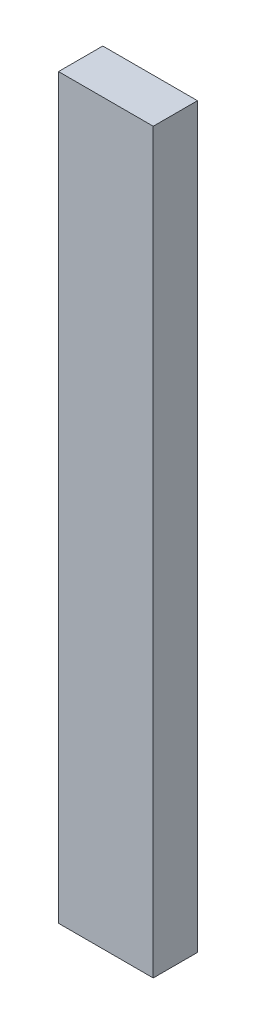
ISO-10303-21;
HEADER;
FILE_DESCRIPTION(('STEP AP214'),'2;1');
FILE_NAME('part.step','',(''),(''),'','','');
FILE_SCHEMA(('AUTOMOTIVE_DESIGN { 1 0 10303 214 1 1 1 1 }'));
ENDSEC;
DATA;
#1=APPLICATION_CONTEXT('core data for automotive mechanical design processes');
#2=APPLICATION_PROTOCOL_DEFINITION('international standard','automotive_design',2000,#1);
#3=PRODUCT_CONTEXT('',#1,'mechanical');
#4=PRODUCT('Part','Part','',(#3));
#5=PRODUCT_RELATED_PRODUCT_CATEGORY('part','',(#4));
#6=PRODUCT_DEFINITION_FORMATION('','',#4);
#7=PRODUCT_DEFINITION_CONTEXT('part definition',#1,'design');
#8=PRODUCT_DEFINITION('design','',#6,#7);
#9=PRODUCT_DEFINITION_SHAPE('','',#8);
#10=(LENGTH_UNIT() NAMED_UNIT(*) SI_UNIT(.MILLI.,.METRE.));
#11=(NAMED_UNIT(*) PLANE_ANGLE_UNIT() SI_UNIT($,.RADIAN.));
#12=(NAMED_UNIT(*) SI_UNIT($,.STERADIAN.) SOLID_ANGLE_UNIT());
#13=UNCERTAINTY_MEASURE_WITH_UNIT(LENGTH_MEASURE(1.E-05),#10,'distance_accuracy_value','');
#14=(GEOMETRIC_REPRESENTATION_CONTEXT(3) GLOBAL_UNCERTAINTY_ASSIGNED_CONTEXT((#13)) GLOBAL_UNIT_ASSIGNED_CONTEXT((#10,
#11,#12)) REPRESENTATION_CONTEXT('',''));
#15=CARTESIAN_POINT('',(0.,0.,0.));
#16=DIRECTION('',(0.,0.,1.));
#17=DIRECTION('',(1.,0.,0.));
#18=AXIS2_PLACEMENT_3D('',#15,#16,#17);
#19=CARTESIAN_POINT('',(0.,0.,3.));
#20=DIRECTION('',(1.,0.,0.));
#21=DIRECTION('',(0.,0.,-1.));
#22=AXIS2_PLACEMENT_3D('',#19,#20,#21);
#23=PLANE('',#22);
#24=DIRECTION('',(0.,-1.,0.));
#25=VECTOR('',#24,1.);
#26=CARTESIAN_POINT('',(0.,0.,0.));
#27=LINE('',#26,#25);
#28=CARTESIAN_POINT('',(0.,50.,0.));
#29=VERTEX_POINT('',#28);
#30=CARTESIAN_POINT('',(0.,0.,0.));
#31=VERTEX_POINT('',#30);
#32=EDGE_CURVE('E107',#29,#31,#27,.T.);
#33=ORIENTED_EDGE('',*,*,#32,.T.);
#34=DIRECTION('',(0.,0.,-1.));
#35=VECTOR('',#34,1.);
#36=CARTESIAN_POINT('',(0.,0.,3.));
#37=LINE('',#36,#35);
#38=CARTESIAN_POINT('',(0.,0.,3.));
#39=VERTEX_POINT('',#38);
#40=EDGE_CURVE('E11',#39,#31,#37,.T.);
#41=ORIENTED_EDGE('',*,*,#40,.F.);
#42=DIRECTION('',(0.,-1.,0.));
#43=VECTOR('',#42,1.);
#44=CARTESIAN_POINT('',(0.,0.,3.));
#45=LINE('',#44,#43);
#46=CARTESIAN_POINT('',(0.,50.,3.));
#47=VERTEX_POINT('',#46);
#48=EDGE_CURVE('E91',#47,#39,#45,.T.);
#49=ORIENTED_EDGE('',*,*,#48,.F.);
#50=DIRECTION('',(0.,0.,-1.));
#51=VECTOR('',#50,1.);
#52=CARTESIAN_POINT('',(0.,50.,3.));
#53=LINE('',#52,#51);
#54=EDGE_CURVE('E103',#47,#29,#53,.T.);
#55=ORIENTED_EDGE('',*,*,#54,.T.);
#56=EDGE_LOOP('',(#33,#41,#49,#55));
#57=FACE_BOUND('',#56,.T.);
#58=ADVANCED_FACE('F39',(#57),#23,.F.);
#59=CARTESIAN_POINT('',(0.,0.,3.));
#60=DIRECTION('',(0.,1.,0.));
#61=DIRECTION('',(0.,0.,1.));
#62=AXIS2_PLACEMENT_3D('',#59,#60,#61);
#63=PLANE('',#62);
#64=DIRECTION('',(1.,0.,0.));
#65=VECTOR('',#64,1.);
#66=CARTESIAN_POINT('',(0.,0.,0.));
#67=LINE('',#66,#65);
#68=CARTESIAN_POINT('',(6.42,0.,0.));
#69=VERTEX_POINT('',#68);
#70=EDGE_CURVE('E96',#31,#69,#67,.T.);
#71=ORIENTED_EDGE('',*,*,#70,.T.);
#72=DIRECTION('',(0.,0.,-1.));
#73=VECTOR('',#72,1.);
#74=CARTESIAN_POINT('',(6.42,0.,3.));
#75=LINE('',#74,#73);
#76=CARTESIAN_POINT('',(6.42,0.,3.));
#77=VERTEX_POINT('',#76);
#78=EDGE_CURVE('E48',#77,#69,#75,.T.);
#79=ORIENTED_EDGE('',*,*,#78,.F.);
#80=DIRECTION('',(1.,0.,0.));
#81=VECTOR('',#80,1.);
#82=CARTESIAN_POINT('',(0.,0.,3.));
#83=LINE('',#82,#81);
#84=EDGE_CURVE('E86',#39,#77,#83,.T.);
#85=ORIENTED_EDGE('',*,*,#84,.F.);
#86=ORIENTED_EDGE('',*,*,#40,.T.);
#87=EDGE_LOOP('',(#71,#79,#85,#86));
#88=FACE_BOUND('',#87,.T.);
#89=ADVANCED_FACE('F95',(#88),#63,.F.);
#90=CARTESIAN_POINT('',(6.42,0.,3.));
#91=DIRECTION('',(-1.,0.,0.));
#92=DIRECTION('',(0.,0.,1.));
#93=AXIS2_PLACEMENT_3D('',#90,#91,#92);
#94=PLANE('',#93);
#95=DIRECTION('',(0.,1.,0.));
#96=VECTOR('',#95,1.);
#97=CARTESIAN_POINT('',(6.42,0.,0.));
#98=LINE('',#97,#96);
#99=CARTESIAN_POINT('',(6.42,50.,0.));
#100=VERTEX_POINT('',#99);
#101=EDGE_CURVE('E73',#69,#100,#98,.T.);
#102=ORIENTED_EDGE('',*,*,#101,.T.);
#103=DIRECTION('',(0.,0.,-1.));
#104=VECTOR('',#103,1.);
#105=CARTESIAN_POINT('',(6.42,50.,3.));
#106=LINE('',#105,#104);
#107=CARTESIAN_POINT('',(6.42,50.,3.));
#108=VERTEX_POINT('',#107);
#109=EDGE_CURVE('E98',#108,#100,#106,.T.);
#110=ORIENTED_EDGE('',*,*,#109,.F.);
#111=DIRECTION('',(0.,1.,0.));
#112=VECTOR('',#111,1.);
#113=CARTESIAN_POINT('',(6.42,0.,3.));
#114=LINE('',#113,#112);
#115=EDGE_CURVE('E89',#77,#108,#114,.T.);
#116=ORIENTED_EDGE('',*,*,#115,.F.);
#117=ORIENTED_EDGE('',*,*,#78,.T.);
#118=EDGE_LOOP('',(#102,#110,#116,#117));
#119=FACE_BOUND('',#118,.T.);
#120=ADVANCED_FACE('F99',(#119),#94,.F.);
#121=CARTESIAN_POINT('',(0.,50.,3.));
#122=DIRECTION('',(0.,-1.,0.));
#123=DIRECTION('',(0.,0.,-1.));
#124=AXIS2_PLACEMENT_3D('',#121,#122,#123);
#125=PLANE('',#124);
#126=DIRECTION('',(-1.,0.,0.));
#127=VECTOR('',#126,1.);
#128=CARTESIAN_POINT('',(0.,50.,0.));
#129=LINE('',#128,#127);
#130=EDGE_CURVE('E79',#100,#29,#129,.T.);
#131=ORIENTED_EDGE('',*,*,#130,.T.);
#132=ORIENTED_EDGE('',*,*,#54,.F.);
#133=DIRECTION('',(-1.,0.,0.));
#134=VECTOR('',#133,1.);
#135=CARTESIAN_POINT('',(0.,50.,3.));
#136=LINE('',#135,#134);
#137=EDGE_CURVE('E56',#108,#47,#136,.T.);
#138=ORIENTED_EDGE('',*,*,#137,.F.);
#139=ORIENTED_EDGE('',*,*,#109,.T.);
#140=EDGE_LOOP('',(#131,#132,#138,#139));
#141=FACE_BOUND('',#140,.T.);
#142=ADVANCED_FACE('F120',(#141),#125,.F.);
#143=CARTESIAN_POINT('',(0.,0.,3.));
#144=DIRECTION('',(0.,0.,-1.));
#145=DIRECTION('',(-1.,0.,0.));
#146=AXIS2_PLACEMENT_3D('',#143,#144,#145);
#147=PLANE('',#146);
#148=ORIENTED_EDGE('',*,*,#48,.T.);
#149=ORIENTED_EDGE('',*,*,#84,.T.);
#150=ORIENTED_EDGE('',*,*,#115,.T.);
#151=ORIENTED_EDGE('',*,*,#137,.T.);
#152=EDGE_LOOP('',(#148,#149,#150,#151));
#153=FACE_BOUND('',#152,.T.);
#154=ADVANCED_FACE('F87',(#153),#147,.F.);
#155=CARTESIAN_POINT('',(0.,0.,0.));
#156=DIRECTION('',(0.,0.,-1.));
#157=DIRECTION('',(-1.,0.,0.));
#158=AXIS2_PLACEMENT_3D('',#155,#156,#157);
#159=PLANE('',#158);
#160=ORIENTED_EDGE('',*,*,#32,.F.);
#161=ORIENTED_EDGE('',*,*,#130,.F.);
#162=ORIENTED_EDGE('',*,*,#101,.F.);
#163=ORIENTED_EDGE('',*,*,#70,.F.);
#164=EDGE_LOOP('',(#160,#161,#162,#163));
#165=FACE_BOUND('',#164,.T.);
#166=ADVANCED_FACE('F123',(#165),#159,.T.);
#167=CLOSED_SHELL('',(#58,#89,#120,#142,#154,#166));
#168=MANIFOLD_SOLID_BREP('B2',#167);
#169=ADVANCED_BREP_SHAPE_REPRESENTATION('',(#18,#168),#14);
#170=SHAPE_DEFINITION_REPRESENTATION(#9,#169);
ENDSEC;
END-ISO-10303-21;
